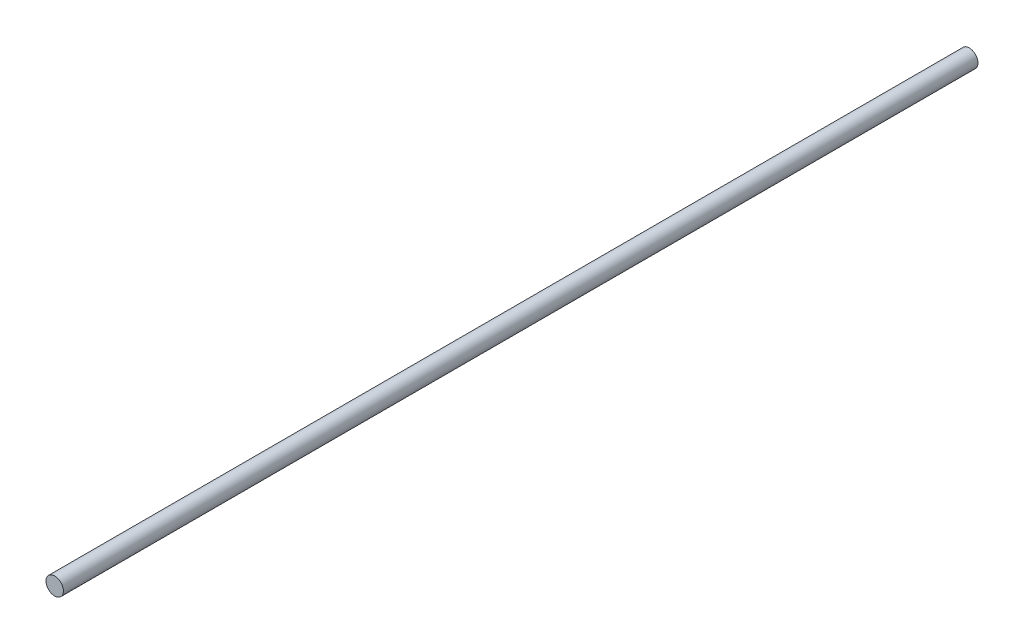
ISO-10303-21;
HEADER;
FILE_DESCRIPTION(('STEP AP214'),'2;1');
FILE_NAME('part.step','',(''),(''),'','','');
FILE_SCHEMA(('AUTOMOTIVE_DESIGN { 1 0 10303 214 1 1 1 1 }'));
ENDSEC;
DATA;
#1=APPLICATION_CONTEXT('core data for automotive mechanical design processes');
#2=APPLICATION_PROTOCOL_DEFINITION('international standard','automotive_design',2000,#1);
#3=PRODUCT_CONTEXT('',#1,'mechanical');
#4=PRODUCT('Part','Part','',(#3));
#5=PRODUCT_RELATED_PRODUCT_CATEGORY('part','',(#4));
#6=PRODUCT_DEFINITION_FORMATION('','',#4);
#7=PRODUCT_DEFINITION_CONTEXT('part definition',#1,'design');
#8=PRODUCT_DEFINITION('design','',#6,#7);
#9=PRODUCT_DEFINITION_SHAPE('','',#8);
#10=(LENGTH_UNIT() NAMED_UNIT(*) SI_UNIT(.MILLI.,.METRE.));
#11=(NAMED_UNIT(*) PLANE_ANGLE_UNIT() SI_UNIT($,.RADIAN.));
#12=(NAMED_UNIT(*) SI_UNIT($,.STERADIAN.) SOLID_ANGLE_UNIT());
#13=UNCERTAINTY_MEASURE_WITH_UNIT(LENGTH_MEASURE(1.E-05),#10,'distance_accuracy_value','');
#14=(GEOMETRIC_REPRESENTATION_CONTEXT(3) GLOBAL_UNCERTAINTY_ASSIGNED_CONTEXT((#13)) GLOBAL_UNIT_ASSIGNED_CONTEXT((#10,
#11,#12)) REPRESENTATION_CONTEXT('',''));
#15=CARTESIAN_POINT('',(0.,0.,0.));
#16=DIRECTION('',(0.,0.,1.));
#17=DIRECTION('',(1.,0.,0.));
#18=AXIS2_PLACEMENT_3D('',#15,#16,#17);
#19=CARTESIAN_POINT('',(0.,0.,420.));
#20=DIRECTION('',(0.,0.,-1.));
#21=DIRECTION('',(-1.,0.,0.));
#22=AXIS2_PLACEMENT_3D('',#19,#20,#21);
#23=CYLINDRICAL_SURFACE('',#22,4.);
#24=CARTESIAN_POINT('',(0.,0.,420.));
#25=DIRECTION('',(0.,0.,1.));
#26=DIRECTION('',(1.,0.,0.));
#27=AXIS2_PLACEMENT_3D('',#24,#25,#26);
#28=CIRCLE('',#27,4.);
#29=CARTESIAN_POINT('',(4.,0.,420.));
#30=VERTEX_POINT('',#29);
#31=EDGE_CURVE('E10',#30,#30,#28,.T.);
#32=ORIENTED_EDGE('',*,*,#31,.F.);
#33=EDGE_LOOP('',(#32));
#34=FACE_BOUND('',#33,.T.);
#35=CARTESIAN_POINT('',(0.,0.,0.));
#36=DIRECTION('',(0.,0.,1.));
#37=DIRECTION('',(1.,0.,0.));
#38=AXIS2_PLACEMENT_3D('',#35,#36,#37);
#39=CIRCLE('',#38,4.);
#40=CARTESIAN_POINT('',(4.,0.,0.));
#41=VERTEX_POINT('',#40);
#42=EDGE_CURVE('E33',#41,#41,#39,.T.);
#43=ORIENTED_EDGE('',*,*,#42,.T.);
#44=EDGE_LOOP('',(#43));
#45=FACE_BOUND('',#44,.T.);
#46=ADVANCED_FACE('F30',(#34,#45),#23,.T.);
#47=CARTESIAN_POINT('',(0.,0.,420.));
#48=DIRECTION('',(0.,0.,1.));
#49=DIRECTION('',(1.,0.,0.));
#50=AXIS2_PLACEMENT_3D('',#47,#48,#49);
#51=PLANE('',#50);
#52=ORIENTED_EDGE('',*,*,#31,.T.);
#53=EDGE_LOOP('',(#52));
#54=FACE_BOUND('',#53,.T.);
#55=ADVANCED_FACE('F45',(#54),#51,.T.);
#56=CARTESIAN_POINT('',(0.,0.,0.));
#57=DIRECTION('',(0.,0.,1.));
#58=DIRECTION('',(1.,0.,0.));
#59=AXIS2_PLACEMENT_3D('',#56,#57,#58);
#60=PLANE('',#59);
#61=ORIENTED_EDGE('',*,*,#42,.F.);
#62=EDGE_LOOP('',(#61));
#63=FACE_BOUND('',#62,.T.);
#64=ADVANCED_FACE('F43',(#63),#60,.F.);
#65=CLOSED_SHELL('',(#46,#55,#64));
#66=MANIFOLD_SOLID_BREP('B2',#65);
#67=ADVANCED_BREP_SHAPE_REPRESENTATION('',(#18,#66),#14);
#68=SHAPE_DEFINITION_REPRESENTATION(#9,#67);
ENDSEC;
END-ISO-10303-21;
